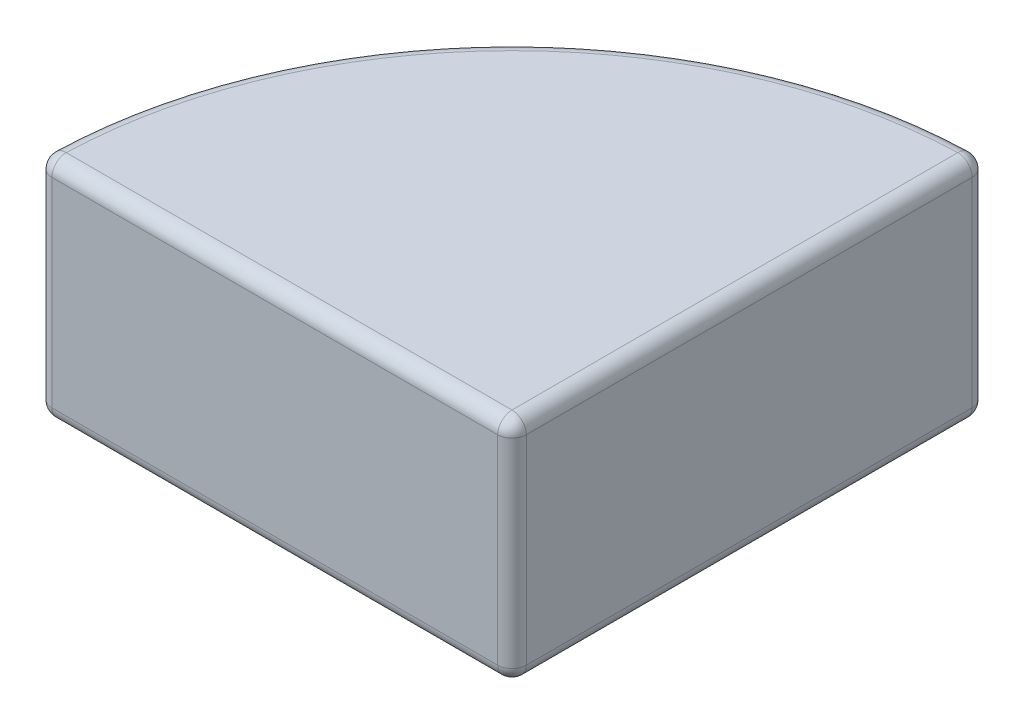
ISO-10303-21;
HEADER;
FILE_DESCRIPTION(('STEP AP214'),'2;1');
FILE_NAME('part.step','',(''),(''),'','','');
FILE_SCHEMA(('AUTOMOTIVE_DESIGN { 1 0 10303 214 1 1 1 1 }'));
ENDSEC;
DATA;
#1=APPLICATION_CONTEXT('core data for automotive mechanical design processes');
#2=APPLICATION_PROTOCOL_DEFINITION('international standard','automotive_design',2000,#1);
#3=PRODUCT_CONTEXT('',#1,'mechanical');
#4=PRODUCT('Part','Part','',(#3));
#5=PRODUCT_RELATED_PRODUCT_CATEGORY('part','',(#4));
#6=PRODUCT_DEFINITION_FORMATION('','',#4);
#7=PRODUCT_DEFINITION_CONTEXT('part definition',#1,'design');
#8=PRODUCT_DEFINITION('design','',#6,#7);
#9=PRODUCT_DEFINITION_SHAPE('','',#8);
#10=(LENGTH_UNIT() NAMED_UNIT(*) SI_UNIT(.MILLI.,.METRE.));
#11=(NAMED_UNIT(*) PLANE_ANGLE_UNIT() SI_UNIT($,.RADIAN.));
#12=(NAMED_UNIT(*) SI_UNIT($,.STERADIAN.) SOLID_ANGLE_UNIT());
#13=UNCERTAINTY_MEASURE_WITH_UNIT(LENGTH_MEASURE(1.E-05),#10,'distance_accuracy_value','');
#14=(GEOMETRIC_REPRESENTATION_CONTEXT(3) GLOBAL_UNCERTAINTY_ASSIGNED_CONTEXT((#13)) GLOBAL_UNIT_ASSIGNED_CONTEXT((#10,
#11,#12)) REPRESENTATION_CONTEXT('',''));
#15=CARTESIAN_POINT('',(0.,0.,0.));
#16=DIRECTION('',(0.,0.,1.));
#17=DIRECTION('',(1.,0.,0.));
#18=AXIS2_PLACEMENT_3D('',#15,#16,#17);
#19=CARTESIAN_POINT('',(0.,0.,0.));
#20=DIRECTION('',(0.,-1.,0.));
#21=DIRECTION('',(0.,0.,-1.));
#22=AXIS2_PLACEMENT_3D('',#19,#20,#21);
#23=PLANE('',#22);
#24=CARTESIAN_POINT('',(-30.,0.,-30.));
#25=DIRECTION('',(0.,-1.,0.));
#26=DIRECTION('',(0.,0.,-1.));
#27=AXIS2_PLACEMENT_3D('',#24,#25,#26);
#28=CIRCLE('',#27,20.);
#29=CARTESIAN_POINT('',(-10.,0.,-30.));
#30=VERTEX_POINT('',#29);
#31=CARTESIAN_POINT('',(-30.,0.,-10.));
#32=VERTEX_POINT('',#31);
#33=EDGE_CURVE('E191',#30,#32,#28,.T.);
#34=ORIENTED_EDGE('',*,*,#33,.F.);
#35=DIRECTION('',(0.,0.,-1.));
#36=VECTOR('',#35,1.);
#37=CARTESIAN_POINT('',(-10.,0.,0.));
#38=LINE('',#37,#36);
#39=CARTESIAN_POINT('',(-10.,0.,-10.));
#40=VERTEX_POINT('',#39);
#41=EDGE_CURVE('E279',#30,#40,#38,.F.);
#42=ORIENTED_EDGE('',*,*,#41,.T.);
#43=DIRECTION('',(1.,0.,0.));
#44=VECTOR('',#43,1.);
#45=CARTESIAN_POINT('',(-331.6,0.,-9.99999999999996));
#46=LINE('',#45,#44);
#47=EDGE_CURVE('E276',#40,#32,#46,.F.);
#48=ORIENTED_EDGE('',*,*,#47,.T.);
#49=EDGE_LOOP('',(#34,#42,#48));
#50=FACE_BOUND('',#49,.T.);
#51=ADVANCED_FACE('F39',(#50),#23,.T.);
#52=CARTESIAN_POINT('',(-30.,0.,-300.104248553732));
#53=DIRECTION('',(0.,-1.,0.));
#54=DIRECTION('',(0.,0.,-1.));
#55=AXIS2_PLACEMENT_3D('',#52,#53,#54);
#56=CIRCLE('',#55,20.);
#57=CARTESIAN_POINT('',(-31.9893899204244,0.,-320.005060792043));
#58=VERTEX_POINT('',#57);
#59=CARTESIAN_POINT('',(-10.,0.,-300.104248553732));
#60=VERTEX_POINT('',#59);
#61=EDGE_CURVE('E287',#58,#60,#56,.T.);
#62=ORIENTED_EDGE('',*,*,#61,.F.);
#63=CARTESIAN_POINT('',(0.,0.,0.));
#64=DIRECTION('',(0.,-1.,0.));
#65=DIRECTION('',(0.,0.,-1.));
#66=AXIS2_PLACEMENT_3D('',#63,#64,#65);
#67=CIRCLE('',#66,321.6);
#68=CARTESIAN_POINT('',(-10.,0.,-321.444489764563));
#69=VERTEX_POINT('',#68);
#70=EDGE_CURVE('E291',#58,#69,#67,.T.);
#71=ORIENTED_EDGE('',*,*,#70,.T.);
#72=DIRECTION('',(0.,0.,-1.));
#73=VECTOR('',#72,1.);
#74=CARTESIAN_POINT('',(-10.,0.,0.));
#75=LINE('',#74,#73);
#76=EDGE_CURVE('E284',#69,#60,#75,.F.);
#77=ORIENTED_EDGE('',*,*,#76,.T.);
#78=EDGE_LOOP('',(#62,#71,#77));
#79=FACE_BOUND('',#78,.T.);
#80=ADVANCED_FACE('F511',(#79),#23,.T.);
#81=CARTESIAN_POINT('',(0.,159.4,0.));
#82=DIRECTION('',(-1.,0.,0.));
#83=DIRECTION('',(0.,0.,1.));
#84=AXIS2_PLACEMENT_3D('',#81,#82,#83);
#85=PLANE('',#84);
#86=DIRECTION('',(0.,0.,-1.));
#87=VECTOR('',#86,1.);
#88=CARTESIAN_POINT('',(0.,10.,-331.6));
#89=LINE('',#88,#87);
#90=CARTESIAN_POINT('',(0.,10.,-10.));
#91=VERTEX_POINT('',#90);
#92=CARTESIAN_POINT('',(0.,10.,-321.444489764563));
#93=VERTEX_POINT('',#92);
#94=EDGE_CURVE('E301',#91,#93,#89,.T.);
#95=ORIENTED_EDGE('',*,*,#94,.T.);
#96=DIRECTION('',(0.,-1.,0.));
#97=VECTOR('',#96,1.);
#98=CARTESIAN_POINT('',(0.,159.4,-321.444489764563));
#99=LINE('',#98,#97);
#100=CARTESIAN_POINT('',(0.,149.4,-321.444489764563));
#101=VERTEX_POINT('',#100);
#102=EDGE_CURVE('E304',#93,#101,#99,.F.);
#103=ORIENTED_EDGE('',*,*,#102,.T.);
#104=DIRECTION('',(0.,0.,-1.));
#105=VECTOR('',#104,1.);
#106=CARTESIAN_POINT('',(0.,149.4,0.));
#107=LINE('',#106,#105);
#108=CARTESIAN_POINT('',(0.,149.4,-10.));
#109=VERTEX_POINT('',#108);
#110=EDGE_CURVE('E298',#101,#109,#107,.F.);
#111=ORIENTED_EDGE('',*,*,#110,.T.);
#112=DIRECTION('',(0.,-1.,0.));
#113=VECTOR('',#112,1.);
#114=CARTESIAN_POINT('',(0.,159.4,-10.));
#115=LINE('',#114,#113);
#116=EDGE_CURVE('E295',#109,#91,#115,.T.);
#117=ORIENTED_EDGE('',*,*,#116,.T.);
#118=EDGE_LOOP('',(#95,#103,#111,#117));
#119=FACE_BOUND('',#118,.T.);
#120=ADVANCED_FACE('F495',(#119),#85,.F.);
#121=CARTESIAN_POINT('',(0.,159.4,0.));
#122=DIRECTION('',(0.,-1.,0.));
#123=DIRECTION('',(0.,0.,-1.));
#124=AXIS2_PLACEMENT_3D('',#121,#122,#123);
#125=CYLINDRICAL_SURFACE('',#124,331.6);
#126=DIRECTION('',(0.,-1.,0.));
#127=VECTOR('',#126,1.);
#128=CARTESIAN_POINT('',(-10.3109452736318,159.4,-331.439654247292));
#129=LINE('',#128,#127);
#130=CARTESIAN_POINT('',(-10.3109452736318,149.4,-331.439654247292));
#131=VERTEX_POINT('',#130);
#132=CARTESIAN_POINT('',(-10.3109452736318,10.,-331.439654247292));
#133=VERTEX_POINT('',#132);
#134=EDGE_CURVE('E259',#131,#133,#129,.T.);
#135=ORIENTED_EDGE('',*,*,#134,.T.);
#136=CARTESIAN_POINT('',(0.,10.,0.));
#137=DIRECTION('',(0.,-1.,0.));
#138=DIRECTION('',(0.,0.,-1.));
#139=AXIS2_PLACEMENT_3D('',#136,#137,#138);
#140=CIRCLE('',#139,331.6);
#141=CARTESIAN_POINT('',(-331.439654247292,10.,-10.3109452736318));
#142=VERTEX_POINT('',#141);
#143=EDGE_CURVE('E262',#133,#142,#140,.F.);
#144=ORIENTED_EDGE('',*,*,#143,.T.);
#145=DIRECTION('',(0.,-1.,0.));
#146=VECTOR('',#145,1.);
#147=CARTESIAN_POINT('',(-331.439654247292,159.4,-10.3109452736318));
#148=LINE('',#147,#146);
#149=CARTESIAN_POINT('',(-331.439654247292,149.4,-10.3109452736318));
#150=VERTEX_POINT('',#149);
#151=EDGE_CURVE('E253',#142,#150,#148,.F.);
#152=ORIENTED_EDGE('',*,*,#151,.T.);
#153=CARTESIAN_POINT('',(0.,149.4,0.));
#154=DIRECTION('',(0.,-1.,0.));
#155=DIRECTION('',(0.,0.,-1.));
#156=AXIS2_PLACEMENT_3D('',#153,#154,#155);
#157=CIRCLE('',#156,331.6);
#158=EDGE_CURVE('E256',#150,#131,#157,.T.);
#159=ORIENTED_EDGE('',*,*,#158,.T.);
#160=EDGE_LOOP('',(#135,#144,#152,#159));
#161=FACE_BOUND('',#160,.T.);
#162=ADVANCED_FACE('F595',(#161),#125,.T.);
#163=CARTESIAN_POINT('',(0.,159.4,0.));
#164=DIRECTION('',(0.,0.,-1.));
#165=DIRECTION('',(-1.,0.,0.));
#166=AXIS2_PLACEMENT_3D('',#163,#164,#165);
#167=PLANE('',#166);
#168=DIRECTION('',(1.,0.,0.));
#169=VECTOR('',#168,1.);
#170=CARTESIAN_POINT('',(0.,149.4,0.));
#171=LINE('',#170,#169);
#172=CARTESIAN_POINT('',(-10.,149.4,0.));
#173=VERTEX_POINT('',#172);
#174=CARTESIAN_POINT('',(-321.444489764563,149.4,0.));
#175=VERTEX_POINT('',#174);
#176=EDGE_CURVE('E49',#173,#175,#171,.F.);
#177=ORIENTED_EDGE('',*,*,#176,.T.);
#178=DIRECTION('',(0.,-1.,0.));
#179=VECTOR('',#178,1.);
#180=CARTESIAN_POINT('',(-321.444489764563,159.4,0.));
#181=LINE('',#180,#179);
#182=CARTESIAN_POINT('',(-321.444489764563,10.,0.));
#183=VERTEX_POINT('',#182);
#184=EDGE_CURVE('E11',#175,#183,#181,.T.);
#185=ORIENTED_EDGE('',*,*,#184,.T.);
#186=DIRECTION('',(1.,0.,0.));
#187=VECTOR('',#186,1.);
#188=CARTESIAN_POINT('',(0.,10.,0.));
#189=LINE('',#188,#187);
#190=CARTESIAN_POINT('',(-10.,10.,0.));
#191=VERTEX_POINT('',#190);
#192=EDGE_CURVE('E318',#183,#191,#189,.T.);
#193=ORIENTED_EDGE('',*,*,#192,.T.);
#194=DIRECTION('',(0.,-1.,0.));
#195=VECTOR('',#194,1.);
#196=CARTESIAN_POINT('',(-10.,159.4,0.));
#197=LINE('',#196,#195);
#198=EDGE_CURVE('E60',#191,#173,#197,.F.);
#199=ORIENTED_EDGE('',*,*,#198,.T.);
#200=EDGE_LOOP('',(#177,#185,#193,#199));
#201=FACE_BOUND('',#200,.T.);
#202=ADVANCED_FACE('F470',(#201),#167,.F.);
#203=CARTESIAN_POINT('',(0.,159.4,0.));
#204=DIRECTION('',(0.,-1.,0.));
#205=DIRECTION('',(0.,0.,-1.));
#206=AXIS2_PLACEMENT_3D('',#203,#204,#205);
#207=PLANE('',#206);
#208=DIRECTION('',(0.,0.,-1.));
#209=VECTOR('',#208,1.);
#210=CARTESIAN_POINT('',(-10.,159.4,0.));
#211=LINE('',#210,#209);
#212=CARTESIAN_POINT('',(-10.,159.4,-10.));
#213=VERTEX_POINT('',#212);
#214=CARTESIAN_POINT('',(-10.,159.4,-321.444489764563));
#215=VERTEX_POINT('',#214);
#216=EDGE_CURVE('E311',#213,#215,#211,.T.);
#217=ORIENTED_EDGE('',*,*,#216,.T.);
#218=CARTESIAN_POINT('',(0.,159.4,0.));
#219=DIRECTION('',(0.,-1.,0.));
#220=DIRECTION('',(0.,0.,-1.));
#221=AXIS2_PLACEMENT_3D('',#218,#219,#220);
#222=CIRCLE('',#221,321.6);
#223=CARTESIAN_POINT('',(-321.444489764563,159.4,-9.99999999999996));
#224=VERTEX_POINT('',#223);
#225=EDGE_CURVE('E314',#215,#224,#222,.F.);
#226=ORIENTED_EDGE('',*,*,#225,.T.);
#227=DIRECTION('',(1.,0.,0.));
#228=VECTOR('',#227,1.);
#229=CARTESIAN_POINT('',(0.,159.4,-10.));
#230=LINE('',#229,#228);
#231=EDGE_CURVE('E308',#224,#213,#230,.T.);
#232=ORIENTED_EDGE('',*,*,#231,.T.);
#233=EDGE_LOOP('',(#217,#226,#232));
#234=FACE_BOUND('',#233,.T.);
#235=ADVANCED_FACE('F585',(#234),#207,.F.);
#236=DIRECTION('',(1.,0.,0.));
#237=VECTOR('',#236,1.);
#238=CARTESIAN_POINT('',(-331.6,0.,-9.99999999999996));
#239=LINE('',#238,#237);
#240=CARTESIAN_POINT('',(-300.104248553732,0.,-9.99999999999996));
#241=VERTEX_POINT('',#240);
#242=CARTESIAN_POINT('',(-321.444489764563,0.,-9.99999999999996));
#243=VERTEX_POINT('',#242);
#244=EDGE_CURVE('E266',#241,#243,#239,.F.);
#245=ORIENTED_EDGE('',*,*,#244,.T.);
#246=CARTESIAN_POINT('',(0.,0.,0.));
#247=DIRECTION('',(0.,-1.,0.));
#248=DIRECTION('',(0.,0.,-1.));
#249=AXIS2_PLACEMENT_3D('',#246,#247,#248);
#250=CIRCLE('',#249,321.6);
#251=CARTESIAN_POINT('',(-320.005060792043,0.,-31.9893899204244));
#252=VERTEX_POINT('',#251);
#253=EDGE_CURVE('E272',#243,#252,#250,.T.);
#254=ORIENTED_EDGE('',*,*,#253,.T.);
#255=CARTESIAN_POINT('',(-300.104248553732,0.,-30.));
#256=DIRECTION('',(0.,-1.,0.));
#257=DIRECTION('',(0.,0.,-1.));
#258=AXIS2_PLACEMENT_3D('',#255,#256,#257);
#259=CIRCLE('',#258,20.);
#260=EDGE_CURVE('E269',#241,#252,#259,.T.);
#261=ORIENTED_EDGE('',*,*,#260,.F.);
#262=EDGE_LOOP('',(#245,#254,#261));
#263=FACE_BOUND('',#262,.T.);
#264=ADVANCED_FACE('F537',(#263),#23,.T.);
#265=CARTESIAN_POINT('',(-20.,159.4,0.));
#266=DIRECTION('',(-1.,0.,0.));
#267=DIRECTION('',(0.,0.,1.));
#268=AXIS2_PLACEMENT_3D('',#265,#266,#267);
#269=PLANE('',#268);
#270=DIRECTION('',(0.,-1.,0.));
#271=VECTOR('',#270,1.);
#272=CARTESIAN_POINT('',(-20.,139.4,-30.));
#273=LINE('',#272,#271);
#274=CARTESIAN_POINT('',(-20.,10.,-30.));
#275=VERTEX_POINT('',#274);
#276=CARTESIAN_POINT('',(-20.,129.4,-30.));
#277=VERTEX_POINT('',#276);
#278=EDGE_CURVE('E180',#275,#277,#273,.F.);
#279=ORIENTED_EDGE('',*,*,#278,.T.);
#280=DIRECTION('',(0.,0.,-1.));
#281=VECTOR('',#280,1.);
#282=CARTESIAN_POINT('',(-20.,129.4,-310.95748905598));
#283=LINE('',#282,#281);
#284=CARTESIAN_POINT('',(-20.,129.4,-300.104248553732));
#285=VERTEX_POINT('',#284);
#286=EDGE_CURVE('E227',#277,#285,#283,.T.);
#287=ORIENTED_EDGE('',*,*,#286,.T.);
#288=DIRECTION('',(0.,1.,0.));
#289=VECTOR('',#288,1.);
#290=CARTESIAN_POINT('',(-20.,0.,-300.104248553732));
#291=LINE('',#290,#289);
#292=CARTESIAN_POINT('',(-20.,10.,-300.104248553732));
#293=VERTEX_POINT('',#292);
#294=EDGE_CURVE('E222',#285,#293,#291,.F.);
#295=ORIENTED_EDGE('',*,*,#294,.T.);
#296=DIRECTION('',(0.,0.,-1.));
#297=VECTOR('',#296,1.);
#298=CARTESIAN_POINT('',(-20.,10.,0.));
#299=LINE('',#298,#297);
#300=EDGE_CURVE('E216',#293,#275,#299,.F.);
#301=ORIENTED_EDGE('',*,*,#300,.T.);
#302=EDGE_LOOP('',(#279,#287,#295,#301));
#303=FACE_BOUND('',#302,.T.);
#304=ADVANCED_FACE('F521',(#303),#269,.T.);
#305=CARTESIAN_POINT('',(0.,159.4,0.));
#306=DIRECTION('',(0.,-1.,0.));
#307=DIRECTION('',(0.,0.,-1.));
#308=AXIS2_PLACEMENT_3D('',#305,#306,#307);
#309=CYLINDRICAL_SURFACE('',#308,311.6);
#310=DIRECTION('',(0.,-1.,0.));
#311=VECTOR('',#310,1.);
#312=CARTESIAN_POINT('',(-30.9946949602122,159.4,-310.054654672887));
#313=LINE('',#312,#311);
#314=CARTESIAN_POINT('',(-30.9946949602122,10.,-310.054654672887));
#315=VERTEX_POINT('',#314);
#316=CARTESIAN_POINT('',(-30.9946949602122,129.4,-310.054654672887));
#317=VERTEX_POINT('',#316);
#318=EDGE_CURVE('E233',#315,#317,#313,.F.);
#319=ORIENTED_EDGE('',*,*,#318,.T.);
#320=CARTESIAN_POINT('',(0.,129.4,0.));
#321=DIRECTION('',(0.,-1.,0.));
#322=DIRECTION('',(0.,0.,-1.));
#323=AXIS2_PLACEMENT_3D('',#320,#321,#322);
#324=CIRCLE('',#323,311.6);
#325=CARTESIAN_POINT('',(-310.054654672887,129.4,-30.9946949602122));
#326=VERTEX_POINT('',#325);
#327=EDGE_CURVE('E240',#317,#326,#324,.F.);
#328=ORIENTED_EDGE('',*,*,#327,.T.);
#329=DIRECTION('',(0.,-1.,0.));
#330=VECTOR('',#329,1.);
#331=CARTESIAN_POINT('',(-310.054654672887,159.4,-30.9946949602122));
#332=LINE('',#331,#330);
#333=CARTESIAN_POINT('',(-310.054654672887,10.,-30.9946949602122));
#334=VERTEX_POINT('',#333);
#335=EDGE_CURVE('E236',#326,#334,#332,.T.);
#336=ORIENTED_EDGE('',*,*,#335,.T.);
#337=CARTESIAN_POINT('',(0.,10.,0.));
#338=DIRECTION('',(0.,-1.,0.));
#339=DIRECTION('',(0.,0.,-1.));
#340=AXIS2_PLACEMENT_3D('',#337,#338,#339);
#341=CIRCLE('',#340,311.6);
#342=EDGE_CURVE('E230',#334,#315,#341,.T.);
#343=ORIENTED_EDGE('',*,*,#342,.T.);
#344=EDGE_LOOP('',(#319,#328,#336,#343));
#345=FACE_BOUND('',#344,.T.);
#346=ADVANCED_FACE('F575',(#345),#309,.F.);
#347=CARTESIAN_POINT('',(0.,159.4,-20.));
#348=DIRECTION('',(0.,0.,-1.));
#349=DIRECTION('',(-1.,0.,0.));
#350=AXIS2_PLACEMENT_3D('',#347,#348,#349);
#351=PLANE('',#350);
#352=DIRECTION('',(0.,1.,0.));
#353=VECTOR('',#352,1.);
#354=CARTESIAN_POINT('',(-300.104248553732,139.4,-20.));
#355=LINE('',#354,#353);
#356=CARTESIAN_POINT('',(-300.104248553732,10.,-20.));
#357=VERTEX_POINT('',#356);
#358=CARTESIAN_POINT('',(-300.104248553732,129.4,-20.));
#359=VERTEX_POINT('',#358);
#360=EDGE_CURVE('E206',#357,#359,#355,.T.);
#361=ORIENTED_EDGE('',*,*,#360,.T.);
#362=DIRECTION('',(1.,0.,0.));
#363=VECTOR('',#362,1.);
#364=CARTESIAN_POINT('',(-20.,129.4,-20.));
#365=LINE('',#364,#363);
#366=CARTESIAN_POINT('',(-30.,129.4,-20.));
#367=VERTEX_POINT('',#366);
#368=EDGE_CURVE('E210',#359,#367,#365,.T.);
#369=ORIENTED_EDGE('',*,*,#368,.T.);
#370=DIRECTION('',(0.,-1.,0.));
#371=VECTOR('',#370,1.);
#372=CARTESIAN_POINT('',(-30.,0.,-20.));
#373=LINE('',#372,#371);
#374=CARTESIAN_POINT('',(-30.,10.,-20.));
#375=VERTEX_POINT('',#374);
#376=EDGE_CURVE('E178',#367,#375,#373,.T.);
#377=ORIENTED_EDGE('',*,*,#376,.T.);
#378=DIRECTION('',(1.,0.,0.));
#379=VECTOR('',#378,1.);
#380=CARTESIAN_POINT('',(0.,10.,-20.));
#381=LINE('',#380,#379);
#382=EDGE_CURVE('E199',#375,#357,#381,.F.);
#383=ORIENTED_EDGE('',*,*,#382,.T.);
#384=EDGE_LOOP('',(#361,#369,#377,#383));
#385=FACE_BOUND('',#384,.T.);
#386=ADVANCED_FACE('F208',(#385),#351,.T.);
#387=CARTESIAN_POINT('',(0.,139.4,0.));
#388=DIRECTION('',(0.,-1.,0.));
#389=DIRECTION('',(0.,0.,-1.));
#390=AXIS2_PLACEMENT_3D('',#387,#388,#389);
#391=PLANE('',#390);
#392=DIRECTION('',(1.,0.,0.));
#393=VECTOR('',#392,1.);
#394=CARTESIAN_POINT('',(-310.95748905598,139.4,-30.));
#395=LINE('',#394,#393);
#396=CARTESIAN_POINT('',(-30.,139.4,-30.));
#397=VERTEX_POINT('',#396);
#398=CARTESIAN_POINT('',(-300.104248553732,139.4,-30.));
#399=VERTEX_POINT('',#398);
#400=EDGE_CURVE('E246',#397,#399,#395,.F.);
#401=ORIENTED_EDGE('',*,*,#400,.T.);
#402=CARTESIAN_POINT('',(0.,139.4,0.));
#403=DIRECTION('',(0.,-1.,0.));
#404=DIRECTION('',(0.,0.,-1.));
#405=AXIS2_PLACEMENT_3D('',#402,#403,#404);
#406=CIRCLE('',#405,301.6);
#407=CARTESIAN_POINT('',(-30.,139.4,-300.104248553732));
#408=VERTEX_POINT('',#407);
#409=EDGE_CURVE('E249',#399,#408,#406,.T.);
#410=ORIENTED_EDGE('',*,*,#409,.T.);
#411=DIRECTION('',(0.,0.,-1.));
#412=VECTOR('',#411,1.);
#413=CARTESIAN_POINT('',(-30.,139.4,-20.));
#414=LINE('',#413,#412);
#415=EDGE_CURVE('E243',#408,#397,#414,.F.);
#416=ORIENTED_EDGE('',*,*,#415,.T.);
#417=EDGE_LOOP('',(#401,#410,#416));
#418=FACE_BOUND('',#417,.T.);
#419=ADVANCED_FACE('F566',(#418),#391,.T.);
#420=CARTESIAN_POINT('',(0.,149.4,-10.));
#421=DIRECTION('',(1.,0.,0.));
#422=DIRECTION('',(0.,0.,-1.));
#423=AXIS2_PLACEMENT_3D('',#420,#421,#422);
#424=CYLINDRICAL_SURFACE('',#423,10.);
#425=CARTESIAN_POINT('',(-10.,149.4,-10.));
#426=DIRECTION('',(1.,0.,0.));
#427=DIRECTION('',(0.,0.,-1.));
#428=AXIS2_PLACEMENT_3D('',#425,#426,#427);
#429=CIRCLE('',#428,10.);
#430=EDGE_CURVE('E450',#213,#173,#429,.T.);
#431=ORIENTED_EDGE('',*,*,#430,.F.);
#432=ORIENTED_EDGE('',*,*,#231,.F.);
#433=CARTESIAN_POINT('',(-321.444489764563,149.4,-9.99999999999996));
#434=DIRECTION('',(-1.,0.,0.));
#435=DIRECTION('',(0.,-1.,0.));
#436=AXIS2_PLACEMENT_3D('',#433,#434,#435);
#437=CIRCLE('',#436,10.);
#438=EDGE_CURVE('E453',#175,#224,#437,.T.);
#439=ORIENTED_EDGE('',*,*,#438,.F.);
#440=ORIENTED_EDGE('',*,*,#176,.F.);
#441=EDGE_LOOP('',(#431,#432,#439,#440));
#442=FACE_BOUND('',#441,.T.);
#443=ADVANCED_FACE('F41',(#442),#424,.T.);
#444=CARTESIAN_POINT('',(-10.,149.4,0.));
#445=DIRECTION('',(0.,0.,-1.));
#446=DIRECTION('',(-1.,0.,0.));
#447=AXIS2_PLACEMENT_3D('',#444,#445,#446);
#448=CYLINDRICAL_SURFACE('',#447,10.);
#449=CARTESIAN_POINT('',(-10.,149.4,-321.444489764563));
#450=DIRECTION('',(0.,0.,-1.));
#451=DIRECTION('',(-1.,0.,0.));
#452=AXIS2_PLACEMENT_3D('',#449,#450,#451);
#453=CIRCLE('',#452,10.);
#454=EDGE_CURVE('E442',#215,#101,#453,.T.);
#455=ORIENTED_EDGE('',*,*,#454,.F.);
#456=ORIENTED_EDGE('',*,*,#216,.F.);
#457=CARTESIAN_POINT('',(-10.,149.4,-10.));
#458=DIRECTION('',(0.,0.,1.));
#459=DIRECTION('',(1.,0.,0.));
#460=AXIS2_PLACEMENT_3D('',#457,#458,#459);
#461=CIRCLE('',#460,10.);
#462=EDGE_CURVE('E446',#109,#213,#461,.T.);
#463=ORIENTED_EDGE('',*,*,#462,.F.);
#464=ORIENTED_EDGE('',*,*,#110,.F.);
#465=EDGE_LOOP('',(#455,#456,#463,#464));
#466=FACE_BOUND('',#465,.T.);
#467=ADVANCED_FACE('F573',(#466),#448,.T.);
#468=CARTESIAN_POINT('',(0.,149.4,0.));
#469=DIRECTION('',(0.,-1.,0.));
#470=DIRECTION('',(0.,0.,-1.));
#471=AXIS2_PLACEMENT_3D('',#468,#469,#470);
#472=TOROIDAL_SURFACE('',#471,321.6,10.);
#473=CARTESIAN_POINT('',(-321.444489764563,149.4,-9.99999999999996));
#474=DIRECTION('',(-0.0310945273631838,0.,0.999516448272894));
#475=DIRECTION('',(0.999516448272894,0.,0.0310945273631838));
#476=AXIS2_PLACEMENT_3D('',#473,#474,#475);
#477=CIRCLE('',#476,10.);
#478=EDGE_CURVE('E43',#224,#150,#477,.T.);
#479=ORIENTED_EDGE('',*,*,#478,.F.);
#480=ORIENTED_EDGE('',*,*,#225,.F.);
#481=CARTESIAN_POINT('',(-10.,149.4,-321.444489764563));
#482=DIRECTION('',(0.999516448272894,0.,-0.0310945273631842));
#483=DIRECTION('',(-0.0310945273631842,0.,-0.999516448272894));
#484=AXIS2_PLACEMENT_3D('',#481,#482,#483);
#485=CIRCLE('',#484,10.);
#486=EDGE_CURVE('E438',#131,#215,#485,.T.);
#487=ORIENTED_EDGE('',*,*,#486,.F.);
#488=ORIENTED_EDGE('',*,*,#158,.F.);
#489=EDGE_LOOP('',(#479,#480,#487,#488));
#490=FACE_BOUND('',#489,.T.);
#491=ADVANCED_FACE('F602',(#490),#472,.T.);
#492=CARTESIAN_POINT('',(-321.444489764563,149.4,-9.99999999999996));
#493=DIRECTION('',(0.,0.,1.));
#494=DIRECTION('',(1.,0.,0.));
#495=AXIS2_PLACEMENT_3D('',#492,#493,#494);
#496=SPHERICAL_SURFACE('',#495,10.);
#497=ORIENTED_EDGE('',*,*,#438,.T.);
#498=ORIENTED_EDGE('',*,*,#478,.T.);
#499=CARTESIAN_POINT('',(-321.444489764563,149.4,-9.99999999999996));
#500=DIRECTION('',(0.,1.,0.));
#501=DIRECTION('',(0.,0.,1.));
#502=AXIS2_PLACEMENT_3D('',#499,#500,#501);
#503=CIRCLE('',#502,10.);
#504=EDGE_CURVE('E434',#175,#150,#503,.F.);
#505=ORIENTED_EDGE('',*,*,#504,.F.);
#506=EDGE_LOOP('',(#497,#498,#505));
#507=FACE_BOUND('',#506,.T.);
#508=ADVANCED_FACE('F460',(#507),#496,.T.);
#509=CARTESIAN_POINT('',(-10.,149.4,-10.));
#510=DIRECTION('',(0.,0.,1.));
#511=DIRECTION('',(1.,0.,0.));
#512=AXIS2_PLACEMENT_3D('',#509,#510,#511);
#513=SPHERICAL_SURFACE('',#512,10.);
#514=ORIENTED_EDGE('',*,*,#462,.T.);
#515=ORIENTED_EDGE('',*,*,#430,.T.);
#516=CARTESIAN_POINT('',(-10.,149.4,-10.));
#517=DIRECTION('',(0.,1.,0.));
#518=DIRECTION('',(0.,0.,1.));
#519=AXIS2_PLACEMENT_3D('',#516,#517,#518);
#520=CIRCLE('',#519,10.);
#521=EDGE_CURVE('E430',#109,#173,#520,.F.);
#522=ORIENTED_EDGE('',*,*,#521,.F.);
#523=EDGE_LOOP('',(#514,#515,#522));
#524=FACE_BOUND('',#523,.T.);
#525=ADVANCED_FACE('F666',(#524),#513,.T.);
#526=CARTESIAN_POINT('',(-10.,149.4,-321.444489764563));
#527=DIRECTION('',(0.,0.,1.));
#528=DIRECTION('',(1.,0.,0.));
#529=AXIS2_PLACEMENT_3D('',#526,#527,#528);
#530=SPHERICAL_SURFACE('',#529,10.);
#531=ORIENTED_EDGE('',*,*,#486,.T.);
#532=ORIENTED_EDGE('',*,*,#454,.T.);
#533=CARTESIAN_POINT('',(-10.,149.4,-321.444489764563));
#534=DIRECTION('',(0.,1.,0.));
#535=DIRECTION('',(0.,0.,1.));
#536=AXIS2_PLACEMENT_3D('',#533,#534,#535);
#537=CIRCLE('',#536,10.);
#538=EDGE_CURVE('E427',#131,#101,#537,.F.);
#539=ORIENTED_EDGE('',*,*,#538,.F.);
#540=EDGE_LOOP('',(#531,#532,#539));
#541=FACE_BOUND('',#540,.T.);
#542=ADVANCED_FACE('F605',(#541),#530,.T.);
#543=CARTESIAN_POINT('',(-321.444489764563,159.4,-9.99999999999996));
#544=DIRECTION('',(0.,-1.,0.));
#545=DIRECTION('',(0.,0.,-1.));
#546=AXIS2_PLACEMENT_3D('',#543,#544,#545);
#547=CYLINDRICAL_SURFACE('',#546,10.);
#548=ORIENTED_EDGE('',*,*,#504,.T.);
#549=ORIENTED_EDGE('',*,*,#151,.F.);
#550=CARTESIAN_POINT('',(-321.444489764563,10.,-9.99999999999996));
#551=DIRECTION('',(0.,-1.,0.));
#552=DIRECTION('',(0.,0.,-1.));
#553=AXIS2_PLACEMENT_3D('',#550,#551,#552);
#554=CIRCLE('',#553,10.);
#555=EDGE_CURVE('E420',#183,#142,#554,.T.);
#556=ORIENTED_EDGE('',*,*,#555,.F.);
#557=ORIENTED_EDGE('',*,*,#184,.F.);
#558=EDGE_LOOP('',(#548,#549,#556,#557));
#559=FACE_BOUND('',#558,.T.);
#560=ADVANCED_FACE('F468',(#559),#547,.T.);
#561=CARTESIAN_POINT('',(-10.,159.4,-10.));
#562=DIRECTION('',(0.,-1.,0.));
#563=DIRECTION('',(0.,0.,-1.));
#564=AXIS2_PLACEMENT_3D('',#561,#562,#563);
#565=CYLINDRICAL_SURFACE('',#564,10.);
#566=ORIENTED_EDGE('',*,*,#521,.T.);
#567=ORIENTED_EDGE('',*,*,#198,.F.);
#568=CARTESIAN_POINT('',(-10.,10.,-10.));
#569=DIRECTION('',(0.,-1.,0.));
#570=DIRECTION('',(0.,0.,-1.));
#571=AXIS2_PLACEMENT_3D('',#568,#569,#570);
#572=CIRCLE('',#571,10.);
#573=EDGE_CURVE('E416',#91,#191,#572,.T.);
#574=ORIENTED_EDGE('',*,*,#573,.F.);
#575=ORIENTED_EDGE('',*,*,#116,.F.);
#576=EDGE_LOOP('',(#566,#567,#574,#575));
#577=FACE_BOUND('',#576,.T.);
#578=ADVANCED_FACE('F475',(#577),#565,.T.);
#579=CARTESIAN_POINT('',(-10.,159.4,-321.444489764563));
#580=DIRECTION('',(0.,-1.,0.));
#581=DIRECTION('',(0.,0.,-1.));
#582=AXIS2_PLACEMENT_3D('',#579,#580,#581);
#583=CYLINDRICAL_SURFACE('',#582,10.);
#584=ORIENTED_EDGE('',*,*,#538,.T.);
#585=ORIENTED_EDGE('',*,*,#102,.F.);
#586=CARTESIAN_POINT('',(-10.,10.,-321.444489764563));
#587=DIRECTION('',(0.,-1.,0.));
#588=DIRECTION('',(0.,0.,-1.));
#589=AXIS2_PLACEMENT_3D('',#586,#587,#588);
#590=CIRCLE('',#589,10.);
#591=EDGE_CURVE('E412',#133,#93,#590,.T.);
#592=ORIENTED_EDGE('',*,*,#591,.F.);
#593=ORIENTED_EDGE('',*,*,#134,.F.);
#594=EDGE_LOOP('',(#584,#585,#592,#593));
#595=FACE_BOUND('',#594,.T.);
#596=ADVANCED_FACE('F498',(#595),#583,.T.);
#597=CARTESIAN_POINT('',(0.,129.4,0.));
#598=DIRECTION('',(0.,-1.,0.));
#599=DIRECTION('',(0.,0.,-1.));
#600=AXIS2_PLACEMENT_3D('',#597,#598,#599);
#601=TOROIDAL_SURFACE('',#600,301.6,10.);
#602=CARTESIAN_POINT('',(-300.104248553732,129.4,-30.));
#603=DIRECTION('',(0.0994694960212204,0.,-0.995040611915556));
#604=DIRECTION('',(-0.995040611915556,0.,-0.0994694960212204));
#605=AXIS2_PLACEMENT_3D('',#602,#603,#604);
#606=CIRCLE('',#605,10.);
#607=EDGE_CURVE('E392',#326,#399,#606,.T.);
#608=ORIENTED_EDGE('',*,*,#607,.F.);
#609=ORIENTED_EDGE('',*,*,#327,.F.);
#610=CARTESIAN_POINT('',(-30.,129.4,-300.104248553732));
#611=DIRECTION('',(-0.995040611915556,0.,0.0994694960212204));
#612=DIRECTION('',(0.0994694960212204,0.,0.995040611915556));
#613=AXIS2_PLACEMENT_3D('',#610,#611,#612);
#614=CIRCLE('',#613,10.);
#615=EDGE_CURVE('E396',#408,#317,#614,.T.);
#616=ORIENTED_EDGE('',*,*,#615,.F.);
#617=ORIENTED_EDGE('',*,*,#409,.F.);
#618=EDGE_LOOP('',(#608,#609,#616,#617));
#619=FACE_BOUND('',#618,.T.);
#620=ADVANCED_FACE('F564',(#619),#601,.F.);
#621=CARTESIAN_POINT('',(0.,10.,0.));
#622=DIRECTION('',(0.,-1.,0.));
#623=DIRECTION('',(0.,0.,-1.));
#624=AXIS2_PLACEMENT_3D('',#621,#622,#623);
#625=TOROIDAL_SURFACE('',#624,321.6,10.);
#626=CARTESIAN_POINT('',(-321.444489764563,10.,-9.99999999999996));
#627=DIRECTION('',(-0.031094527363184,0.,0.999516448272894));
#628=DIRECTION('',(0.999516448272894,0.,0.031094527363184));
#629=AXIS2_PLACEMENT_3D('',#626,#627,#628);
#630=CIRCLE('',#629,10.);
#631=EDGE_CURVE('E423',#142,#243,#630,.T.);
#632=ORIENTED_EDGE('',*,*,#631,.F.);
#633=ORIENTED_EDGE('',*,*,#143,.F.);
#634=CARTESIAN_POINT('',(-10.,10.,-321.444489764563));
#635=DIRECTION('',(0.999516448272894,0.,-0.0310945273631838));
#636=DIRECTION('',(-0.0310945273631838,0.,-0.999516448272894));
#637=AXIS2_PLACEMENT_3D('',#634,#635,#636);
#638=CIRCLE('',#637,10.);
#639=EDGE_CURVE('E408',#69,#133,#638,.T.);
#640=ORIENTED_EDGE('',*,*,#639,.F.);
#641=ORIENTED_EDGE('',*,*,#70,.F.);
#642=CARTESIAN_POINT('',(0.,0.,0.));
#643=DIRECTION('',(0.,-1.,0.));
#644=DIRECTION('',(0.,0.,-1.));
#645=AXIS2_PLACEMENT_3D('',#642,#643,#644);
#646=CIRCLE('',#645,321.6);
#647=EDGE_CURVE('E404',#252,#58,#646,.T.);
#648=ORIENTED_EDGE('',*,*,#647,.F.);
#649=ORIENTED_EDGE('',*,*,#253,.F.);
#650=EDGE_LOOP('',(#632,#633,#640,#641,#648,#649));
#651=FACE_BOUND('',#650,.T.);
#652=ADVANCED_FACE('F508',(#651),#625,.T.);
#653=CARTESIAN_POINT('',(-321.444489764563,10.,-9.99999999999996));
#654=DIRECTION('',(0.,0.,1.));
#655=DIRECTION('',(1.,0.,0.));
#656=AXIS2_PLACEMENT_3D('',#653,#654,#655);
#657=SPHERICAL_SURFACE('',#656,10.);
#658=ORIENTED_EDGE('',*,*,#555,.T.);
#659=ORIENTED_EDGE('',*,*,#631,.T.);
#660=CARTESIAN_POINT('',(-321.444489764563,10.,-9.99999999999996));
#661=DIRECTION('',(-1.,0.,0.));
#662=DIRECTION('',(0.,0.,1.));
#663=AXIS2_PLACEMENT_3D('',#660,#661,#662);
#664=CIRCLE('',#663,10.);
#665=EDGE_CURVE('E377',#183,#243,#664,.F.);
#666=ORIENTED_EDGE('',*,*,#665,.F.);
#667=EDGE_LOOP('',(#658,#659,#666));
#668=FACE_BOUND('',#667,.T.);
#669=ADVANCED_FACE('F648',(#668),#657,.T.);
#670=CARTESIAN_POINT('',(-10.,10.,-10.));
#671=DIRECTION('',(0.,0.,1.));
#672=DIRECTION('',(1.,0.,0.));
#673=AXIS2_PLACEMENT_3D('',#670,#671,#672);
#674=SPHERICAL_SURFACE('',#673,10.);
#675=CARTESIAN_POINT('',(-10.,10.,-10.));
#676=DIRECTION('',(0.,0.,1.));
#677=DIRECTION('',(1.,0.,0.));
#678=AXIS2_PLACEMENT_3D('',#675,#676,#677);
#679=CIRCLE('',#678,10.);
#680=EDGE_CURVE('E369',#91,#40,#679,.F.);
#681=ORIENTED_EDGE('',*,*,#680,.F.);
#682=ORIENTED_EDGE('',*,*,#573,.T.);
#683=CARTESIAN_POINT('',(-10.,10.,-10.));
#684=DIRECTION('',(1.,0.,0.));
#685=DIRECTION('',(0.,0.,-1.));
#686=AXIS2_PLACEMENT_3D('',#683,#684,#685);
#687=CIRCLE('',#686,10.);
#688=EDGE_CURVE('E373',#40,#191,#687,.F.);
#689=ORIENTED_EDGE('',*,*,#688,.F.);
#690=EDGE_LOOP('',(#681,#682,#689));
#691=FACE_BOUND('',#690,.T.);
#692=ADVANCED_FACE('F481',(#691),#674,.T.);
#693=CARTESIAN_POINT('',(-10.,10.,-321.444489764563));
#694=DIRECTION('',(0.,0.,1.));
#695=DIRECTION('',(1.,0.,0.));
#696=AXIS2_PLACEMENT_3D('',#693,#694,#695);
#697=SPHERICAL_SURFACE('',#696,10.);
#698=ORIENTED_EDGE('',*,*,#639,.T.);
#699=ORIENTED_EDGE('',*,*,#591,.T.);
#700=CARTESIAN_POINT('',(-10.,10.,-321.444489764563));
#701=DIRECTION('',(0.,0.,-1.));
#702=DIRECTION('',(0.,1.,0.));
#703=AXIS2_PLACEMENT_3D('',#700,#701,#702);
#704=CIRCLE('',#703,10.);
#705=EDGE_CURVE('E365',#69,#93,#704,.F.);
#706=ORIENTED_EDGE('',*,*,#705,.F.);
#707=EDGE_LOOP('',(#698,#699,#706));
#708=FACE_BOUND('',#707,.T.);
#709=ADVANCED_FACE('F502',(#708),#697,.T.);
#710=CARTESIAN_POINT('',(-300.104248553732,159.4,-30.));
#711=DIRECTION('',(0.,-1.,0.));
#712=DIRECTION('',(0.,0.,-1.));
#713=AXIS2_PLACEMENT_3D('',#710,#711,#712);
#714=CYLINDRICAL_SURFACE('',#713,10.);
#715=CARTESIAN_POINT('',(-300.104248553732,10.,-30.));
#716=DIRECTION('',(0.,-1.,0.));
#717=DIRECTION('',(0.,0.,-1.));
#718=AXIS2_PLACEMENT_3D('',#715,#716,#717);
#719=CIRCLE('',#718,10.);
#720=EDGE_CURVE('E384',#334,#357,#719,.F.);
#721=ORIENTED_EDGE('',*,*,#720,.F.);
#722=ORIENTED_EDGE('',*,*,#335,.F.);
#723=CARTESIAN_POINT('',(-300.104248553732,129.4,-30.));
#724=DIRECTION('',(0.,-1.,0.));
#725=DIRECTION('',(0.,0.,-1.));
#726=AXIS2_PLACEMENT_3D('',#723,#724,#725);
#727=CIRCLE('',#726,10.);
#728=EDGE_CURVE('E388',#359,#326,#727,.T.);
#729=ORIENTED_EDGE('',*,*,#728,.F.);
#730=ORIENTED_EDGE('',*,*,#360,.F.);
#731=EDGE_LOOP('',(#721,#722,#729,#730));
#732=FACE_BOUND('',#731,.T.);
#733=ADVANCED_FACE('F543',(#732),#714,.F.);
#734=CARTESIAN_POINT('',(0.,10.,0.));
#735=DIRECTION('',(0.,-1.,0.));
#736=DIRECTION('',(0.,0.,-1.));
#737=AXIS2_PLACEMENT_3D('',#734,#735,#736);
#738=TOROIDAL_SURFACE('',#737,321.6,10.);
#739=CARTESIAN_POINT('',(-31.9893899204244,10.,-320.005060792043));
#740=DIRECTION('',(0.995040611915556,0.,-0.0994694960212204));
#741=DIRECTION('',(-0.0994694960212204,0.,-0.995040611915556));
#742=AXIS2_PLACEMENT_3D('',#739,#740,#741);
#743=CIRCLE('',#742,10.);
#744=EDGE_CURVE('E361',#315,#58,#743,.T.);
#745=ORIENTED_EDGE('',*,*,#744,.F.);
#746=ORIENTED_EDGE('',*,*,#342,.F.);
#747=CARTESIAN_POINT('',(-320.005060792043,10.,-31.9893899204244));
#748=DIRECTION('',(-0.0994694960212206,0.,0.995040611915556));
#749=DIRECTION('',(0.995040611915556,0.,0.0994694960212206));
#750=AXIS2_PLACEMENT_3D('',#747,#748,#749);
#751=CIRCLE('',#750,10.);
#752=EDGE_CURVE('E381',#252,#334,#751,.T.);
#753=ORIENTED_EDGE('',*,*,#752,.F.);
#754=ORIENTED_EDGE('',*,*,#647,.T.);
#755=EDGE_LOOP('',(#745,#746,#753,#754));
#756=FACE_BOUND('',#755,.T.);
#757=ADVANCED_FACE('F533',(#756),#738,.T.);
#758=CARTESIAN_POINT('',(-30.,159.4,-300.104248553732));
#759=DIRECTION('',(0.,-1.,0.));
#760=DIRECTION('',(0.,0.,-1.));
#761=AXIS2_PLACEMENT_3D('',#758,#759,#760);
#762=CYLINDRICAL_SURFACE('',#761,10.);
#763=CARTESIAN_POINT('',(-30.,129.4,-300.104248553732));
#764=DIRECTION('',(0.,-1.,0.));
#765=DIRECTION('',(0.,0.,-1.));
#766=AXIS2_PLACEMENT_3D('',#763,#764,#765);
#767=CIRCLE('',#766,10.);
#768=EDGE_CURVE('E400',#317,#285,#767,.T.);
#769=ORIENTED_EDGE('',*,*,#768,.F.);
#770=ORIENTED_EDGE('',*,*,#318,.F.);
#771=CARTESIAN_POINT('',(-30.,10.,-300.104248553732));
#772=DIRECTION('',(0.,-1.,0.));
#773=DIRECTION('',(0.,0.,-1.));
#774=AXIS2_PLACEMENT_3D('',#771,#772,#773);
#775=CIRCLE('',#774,10.);
#776=EDGE_CURVE('E357',#293,#315,#775,.F.);
#777=ORIENTED_EDGE('',*,*,#776,.F.);
#778=ORIENTED_EDGE('',*,*,#294,.F.);
#779=EDGE_LOOP('',(#769,#770,#777,#778));
#780=FACE_BOUND('',#779,.T.);
#781=ADVANCED_FACE('F528',(#780),#762,.F.);
#782=CARTESIAN_POINT('',(-30.,129.4,-300.104248553732));
#783=DIRECTION('',(0.,0.,1.));
#784=DIRECTION('',(1.,0.,0.));
#785=AXIS2_PLACEMENT_3D('',#782,#783,#784);
#786=SPHERICAL_SURFACE('',#785,10.);
#787=ORIENTED_EDGE('',*,*,#615,.T.);
#788=ORIENTED_EDGE('',*,*,#768,.T.);
#789=CARTESIAN_POINT('',(-30.,129.4,-300.104248553732));
#790=DIRECTION('',(0.,0.,1.));
#791=DIRECTION('',(1.,0.,0.));
#792=AXIS2_PLACEMENT_3D('',#789,#790,#791);
#793=CIRCLE('',#792,10.);
#794=EDGE_CURVE('E353',#408,#285,#793,.F.);
#795=ORIENTED_EDGE('',*,*,#794,.F.);
#796=EDGE_LOOP('',(#787,#788,#795));
#797=FACE_BOUND('',#796,.T.);
#798=ADVANCED_FACE('F561',(#797),#786,.F.);
#799=CARTESIAN_POINT('',(-300.104248553732,129.4,-30.));
#800=DIRECTION('',(0.,0.,1.));
#801=DIRECTION('',(1.,0.,0.));
#802=AXIS2_PLACEMENT_3D('',#799,#800,#801);
#803=SPHERICAL_SURFACE('',#802,10.);
#804=ORIENTED_EDGE('',*,*,#728,.T.);
#805=ORIENTED_EDGE('',*,*,#607,.T.);
#806=CARTESIAN_POINT('',(-300.104248553732,129.4,-30.));
#807=DIRECTION('',(1.,0.,0.));
#808=DIRECTION('',(0.,0.,-1.));
#809=AXIS2_PLACEMENT_3D('',#806,#807,#808);
#810=CIRCLE('',#809,10.);
#811=EDGE_CURVE('E349',#359,#399,#810,.F.);
#812=ORIENTED_EDGE('',*,*,#811,.F.);
#813=EDGE_LOOP('',(#804,#805,#812));
#814=FACE_BOUND('',#813,.T.);
#815=ADVANCED_FACE('F548',(#814),#803,.F.);
#816=CARTESIAN_POINT('',(-300.104248553732,10.,-30.));
#817=DIRECTION('',(0.,-1.,0.));
#818=DIRECTION('',(0.,0.,-1.));
#819=AXIS2_PLACEMENT_3D('',#816,#817,#818);
#820=TOROIDAL_SURFACE('',#819,20.,10.);
#821=ORIENTED_EDGE('',*,*,#752,.T.);
#822=ORIENTED_EDGE('',*,*,#720,.T.);
#823=CARTESIAN_POINT('',(-300.104248553732,10.,-9.99999999999996));
#824=DIRECTION('',(-1.,0.,0.));
#825=DIRECTION('',(0.,0.,1.));
#826=AXIS2_PLACEMENT_3D('',#823,#824,#825);
#827=CIRCLE('',#826,10.);
#828=EDGE_CURVE('E202',#241,#357,#827,.F.);
#829=ORIENTED_EDGE('',*,*,#828,.F.);
#830=ORIENTED_EDGE('',*,*,#260,.T.);
#831=EDGE_LOOP('',(#821,#822,#829,#830));
#832=FACE_BOUND('',#831,.T.);
#833=ADVANCED_FACE('F539',(#832),#820,.T.);
#834=CARTESIAN_POINT('',(0.,10.,-10.));
#835=DIRECTION('',(-1.,0.,0.));
#836=DIRECTION('',(0.,0.,1.));
#837=AXIS2_PLACEMENT_3D('',#834,#835,#836);
#838=CYLINDRICAL_SURFACE('',#837,10.);
#839=ORIENTED_EDGE('',*,*,#665,.T.);
#840=ORIENTED_EDGE('',*,*,#244,.F.);
#841=DIRECTION('',(1.,0.,0.));
#842=VECTOR('',#841,1.);
#843=CARTESIAN_POINT('',(-331.6,0.,-9.99999999999996));
#844=LINE('',#843,#842);
#845=EDGE_CURVE('E344',#32,#241,#844,.F.);
#846=ORIENTED_EDGE('',*,*,#845,.F.);
#847=ORIENTED_EDGE('',*,*,#47,.F.);
#848=ORIENTED_EDGE('',*,*,#688,.T.);
#849=ORIENTED_EDGE('',*,*,#192,.F.);
#850=EDGE_LOOP('',(#839,#840,#846,#847,#848,#849));
#851=FACE_BOUND('',#850,.T.);
#852=ADVANCED_FACE('F484',(#851),#838,.T.);
#853=CARTESIAN_POINT('',(-10.,10.,0.));
#854=DIRECTION('',(0.,0.,1.));
#855=DIRECTION('',(1.,0.,0.));
#856=AXIS2_PLACEMENT_3D('',#853,#854,#855);
#857=CYLINDRICAL_SURFACE('',#856,10.);
#858=ORIENTED_EDGE('',*,*,#680,.T.);
#859=ORIENTED_EDGE('',*,*,#41,.F.);
#860=DIRECTION('',(0.,0.,-1.));
#861=VECTOR('',#860,1.);
#862=CARTESIAN_POINT('',(-10.,0.,0.));
#863=LINE('',#862,#861);
#864=EDGE_CURVE('E340',#60,#30,#863,.F.);
#865=ORIENTED_EDGE('',*,*,#864,.F.);
#866=ORIENTED_EDGE('',*,*,#76,.F.);
#867=ORIENTED_EDGE('',*,*,#705,.T.);
#868=ORIENTED_EDGE('',*,*,#94,.F.);
#869=EDGE_LOOP('',(#858,#859,#865,#866,#867,#868));
#870=FACE_BOUND('',#869,.T.);
#871=ADVANCED_FACE('F491',(#870),#857,.T.);
#872=CARTESIAN_POINT('',(-30.,10.,-300.104248553732));
#873=DIRECTION('',(0.,-1.,0.));
#874=DIRECTION('',(0.,0.,-1.));
#875=AXIS2_PLACEMENT_3D('',#872,#873,#874);
#876=TOROIDAL_SURFACE('',#875,20.,10.);
#877=ORIENTED_EDGE('',*,*,#744,.T.);
#878=ORIENTED_EDGE('',*,*,#61,.T.);
#879=CARTESIAN_POINT('',(-10.,10.,-300.104248553732));
#880=DIRECTION('',(0.,0.,-1.));
#881=DIRECTION('',(-1.,0.,0.));
#882=AXIS2_PLACEMENT_3D('',#879,#880,#881);
#883=CIRCLE('',#882,10.);
#884=EDGE_CURVE('E336',#293,#60,#883,.F.);
#885=ORIENTED_EDGE('',*,*,#884,.F.);
#886=ORIENTED_EDGE('',*,*,#776,.T.);
#887=EDGE_LOOP('',(#877,#878,#885,#886));
#888=FACE_BOUND('',#887,.T.);
#889=ADVANCED_FACE('F514',(#888),#876,.T.);
#890=CARTESIAN_POINT('',(-30.,129.4,0.));
#891=DIRECTION('',(0.,0.,1.));
#892=DIRECTION('',(1.,0.,0.));
#893=AXIS2_PLACEMENT_3D('',#890,#891,#892);
#894=CYLINDRICAL_SURFACE('',#893,10.);
#895=ORIENTED_EDGE('',*,*,#794,.T.);
#896=ORIENTED_EDGE('',*,*,#286,.F.);
#897=CARTESIAN_POINT('',(-30.,129.4,-30.));
#898=DIRECTION('',(0.,0.,-1.));
#899=DIRECTION('',(-1.,0.,0.));
#900=AXIS2_PLACEMENT_3D('',#897,#898,#899);
#901=CIRCLE('',#900,10.);
#902=EDGE_CURVE('E332',#397,#277,#901,.T.);
#903=ORIENTED_EDGE('',*,*,#902,.F.);
#904=ORIENTED_EDGE('',*,*,#415,.F.);
#905=EDGE_LOOP('',(#895,#896,#903,#904));
#906=FACE_BOUND('',#905,.T.);
#907=ADVANCED_FACE('F557',(#906),#894,.F.);
#908=CARTESIAN_POINT('',(0.,129.4,-30.));
#909=DIRECTION('',(-1.,0.,0.));
#910=DIRECTION('',(0.,0.,1.));
#911=AXIS2_PLACEMENT_3D('',#908,#909,#910);
#912=CYLINDRICAL_SURFACE('',#911,10.);
#913=ORIENTED_EDGE('',*,*,#811,.T.);
#914=ORIENTED_EDGE('',*,*,#400,.F.);
#915=CARTESIAN_POINT('',(-30.,129.4,-30.));
#916=DIRECTION('',(-1.,0.,0.));
#917=DIRECTION('',(0.,0.,1.));
#918=AXIS2_PLACEMENT_3D('',#915,#916,#917);
#919=CIRCLE('',#918,10.);
#920=EDGE_CURVE('E195',#367,#397,#919,.T.);
#921=ORIENTED_EDGE('',*,*,#920,.F.);
#922=ORIENTED_EDGE('',*,*,#368,.F.);
#923=EDGE_LOOP('',(#913,#914,#921,#922));
#924=FACE_BOUND('',#923,.T.);
#925=ADVANCED_FACE('F551',(#924),#912,.F.);
#926=CARTESIAN_POINT('',(0.,10.,-10.));
#927=DIRECTION('',(1.,0.,0.));
#928=DIRECTION('',(0.,0.,-1.));
#929=AXIS2_PLACEMENT_3D('',#926,#927,#928);
#930=CYLINDRICAL_SURFACE('',#929,10.);
#931=ORIENTED_EDGE('',*,*,#828,.T.);
#932=ORIENTED_EDGE('',*,*,#382,.F.);
#933=CARTESIAN_POINT('',(-30.,10.,-10.));
#934=DIRECTION('',(1.,0.,0.));
#935=DIRECTION('',(0.,0.,-1.));
#936=AXIS2_PLACEMENT_3D('',#933,#934,#935);
#937=CIRCLE('',#936,10.);
#938=EDGE_CURVE('E187',#32,#375,#937,.T.);
#939=ORIENTED_EDGE('',*,*,#938,.F.);
#940=ORIENTED_EDGE('',*,*,#845,.T.);
#941=EDGE_LOOP('',(#931,#932,#939,#940));
#942=FACE_BOUND('',#941,.T.);
#943=ADVANCED_FACE('F200',(#942),#930,.T.);
#944=CARTESIAN_POINT('',(-10.,10.,0.));
#945=DIRECTION('',(0.,0.,-1.));
#946=DIRECTION('',(-1.,0.,0.));
#947=AXIS2_PLACEMENT_3D('',#944,#945,#946);
#948=CYLINDRICAL_SURFACE('',#947,10.);
#949=ORIENTED_EDGE('',*,*,#884,.T.);
#950=ORIENTED_EDGE('',*,*,#864,.T.);
#951=CARTESIAN_POINT('',(-10.,10.,-30.));
#952=DIRECTION('',(0.,0.,1.));
#953=DIRECTION('',(1.,0.,0.));
#954=AXIS2_PLACEMENT_3D('',#951,#952,#953);
#955=CIRCLE('',#954,10.);
#956=EDGE_CURVE('E196',#275,#30,#955,.T.);
#957=ORIENTED_EDGE('',*,*,#956,.F.);
#958=ORIENTED_EDGE('',*,*,#300,.F.);
#959=EDGE_LOOP('',(#949,#950,#957,#958));
#960=FACE_BOUND('',#959,.T.);
#961=ADVANCED_FACE('F519',(#960),#948,.T.);
#962=CARTESIAN_POINT('',(-30.,129.4,-30.));
#963=DIRECTION('',(0.,0.,1.));
#964=DIRECTION('',(1.,0.,0.));
#965=AXIS2_PLACEMENT_3D('',#962,#963,#964);
#966=SPHERICAL_SURFACE('',#965,10.);
#967=ORIENTED_EDGE('',*,*,#920,.T.);
#968=ORIENTED_EDGE('',*,*,#902,.T.);
#969=CARTESIAN_POINT('',(-30.,129.4,-30.));
#970=DIRECTION('',(0.,-1.,0.));
#971=DIRECTION('',(0.,0.,-1.));
#972=AXIS2_PLACEMENT_3D('',#969,#970,#971);
#973=CIRCLE('',#972,10.);
#974=EDGE_CURVE('E183',#367,#277,#973,.F.);
#975=ORIENTED_EDGE('',*,*,#974,.F.);
#976=EDGE_LOOP('',(#967,#968,#975));
#977=FACE_BOUND('',#976,.T.);
#978=ADVANCED_FACE('F555',(#977),#966,.F.);
#979=CARTESIAN_POINT('',(-30.,10.,-30.));
#980=DIRECTION('',(0.,-1.,0.));
#981=DIRECTION('',(0.,0.,-1.));
#982=AXIS2_PLACEMENT_3D('',#979,#980,#981);
#983=TOROIDAL_SURFACE('',#982,20.,10.);
#984=ORIENTED_EDGE('',*,*,#33,.T.);
#985=ORIENTED_EDGE('',*,*,#938,.T.);
#986=CARTESIAN_POINT('',(-30.,10.,-30.));
#987=DIRECTION('',(0.,-1.,0.));
#988=DIRECTION('',(0.,0.,-1.));
#989=AXIS2_PLACEMENT_3D('',#986,#987,#988);
#990=CIRCLE('',#989,10.);
#991=EDGE_CURVE('E174',#275,#375,#990,.T.);
#992=ORIENTED_EDGE('',*,*,#991,.F.);
#993=ORIENTED_EDGE('',*,*,#956,.T.);
#994=EDGE_LOOP('',(#984,#985,#992,#993));
#995=FACE_BOUND('',#994,.T.);
#996=ADVANCED_FACE('F189',(#995),#983,.T.);
#997=CARTESIAN_POINT('',(-30.,159.4,-30.));
#998=DIRECTION('',(0.,1.,0.));
#999=DIRECTION('',(0.,0.,1.));
#1000=AXIS2_PLACEMENT_3D('',#997,#998,#999);
#1001=CYLINDRICAL_SURFACE('',#1000,10.);
#1002=ORIENTED_EDGE('',*,*,#974,.T.);
#1003=ORIENTED_EDGE('',*,*,#278,.F.);
#1004=ORIENTED_EDGE('',*,*,#991,.T.);
#1005=ORIENTED_EDGE('',*,*,#376,.F.);
#1006=EDGE_LOOP('',(#1002,#1003,#1004,#1005));
#1007=FACE_BOUND('',#1006,.T.);
#1008=ADVANCED_FACE('F176',(#1007),#1001,.F.);
#1009=CLOSED_SHELL('',(#51,#80,#120,#162,#202,#235,#264,#304,#346,#386,#419,#443,#467,#491,#508,
#525,#542,#560,#578,#596,#620,#652,#669,#692,#709,#733,#757,#781,#798,#815,#833,#852,#871,#889,
#907,#925,#943,#961,#978,#996,#1008));
#1010=MANIFOLD_SOLID_BREP('B2',#1009);
#1011=ADVANCED_BREP_SHAPE_REPRESENTATION('',(#18,#1010),#14);
#1012=SHAPE_DEFINITION_REPRESENTATION(#9,#1011);
ENDSEC;
END-ISO-10303-21;
